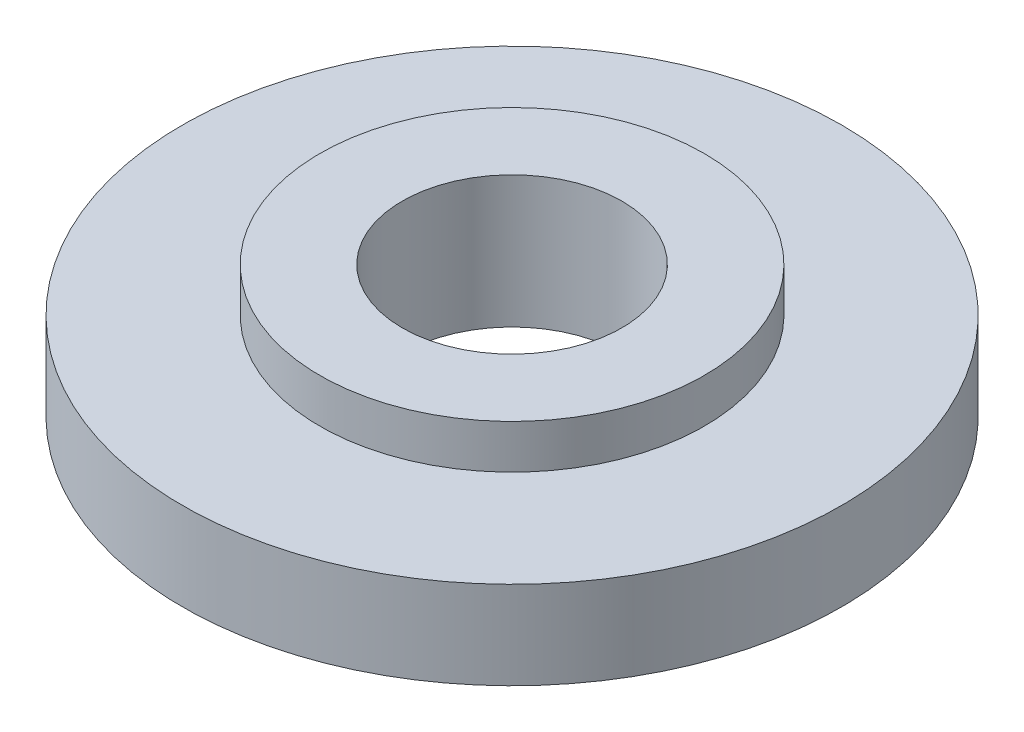
ISO-10303-21;
HEADER;
FILE_DESCRIPTION(('STEP AP214'),'2;1');
FILE_NAME('part.step','',(''),(''),'','','');
FILE_SCHEMA(('AUTOMOTIVE_DESIGN { 1 0 10303 214 1 1 1 1 }'));
ENDSEC;
DATA;
#1=APPLICATION_CONTEXT('core data for automotive mechanical design processes');
#2=APPLICATION_PROTOCOL_DEFINITION('international standard','automotive_design',2000,#1);
#3=PRODUCT_CONTEXT('',#1,'mechanical');
#4=PRODUCT('Part','Part','',(#3));
#5=PRODUCT_RELATED_PRODUCT_CATEGORY('part','',(#4));
#6=PRODUCT_DEFINITION_FORMATION('','',#4);
#7=PRODUCT_DEFINITION_CONTEXT('part definition',#1,'design');
#8=PRODUCT_DEFINITION('design','',#6,#7);
#9=PRODUCT_DEFINITION_SHAPE('','',#8);
#10=(LENGTH_UNIT() NAMED_UNIT(*) SI_UNIT(.MILLI.,.METRE.));
#11=(NAMED_UNIT(*) PLANE_ANGLE_UNIT() SI_UNIT($,.RADIAN.));
#12=(NAMED_UNIT(*) SI_UNIT($,.STERADIAN.) SOLID_ANGLE_UNIT());
#13=UNCERTAINTY_MEASURE_WITH_UNIT(LENGTH_MEASURE(1.E-05),#10,'distance_accuracy_value','');
#14=(GEOMETRIC_REPRESENTATION_CONTEXT(3) GLOBAL_UNCERTAINTY_ASSIGNED_CONTEXT((#13)) GLOBAL_UNIT_ASSIGNED_CONTEXT((#10,
#11,#12)) REPRESENTATION_CONTEXT('',''));
#15=CARTESIAN_POINT('',(0.,0.,0.));
#16=DIRECTION('',(0.,0.,1.));
#17=DIRECTION('',(1.,0.,0.));
#18=AXIS2_PLACEMENT_3D('',#15,#16,#17);
#19=CARTESIAN_POINT('',(0.,-10.,0.));
#20=DIRECTION('',(0.,-1.,0.));
#21=DIRECTION('',(0.,0.,-1.));
#22=AXIS2_PLACEMENT_3D('',#19,#20,#21);
#23=CYLINDRICAL_SURFACE('',#22,20.);
#24=CARTESIAN_POINT('',(0.,0.,0.));
#25=DIRECTION('',(0.,-1.,0.));
#26=DIRECTION('',(0.,0.,-1.));
#27=AXIS2_PLACEMENT_3D('',#24,#25,#26);
#28=CIRCLE('',#27,20.);
#29=CARTESIAN_POINT('',(0.,0.,-20.));
#30=VERTEX_POINT('',#29);
#31=EDGE_CURVE('E10',#30,#30,#28,.T.);
#32=ORIENTED_EDGE('',*,*,#31,.T.);
#33=EDGE_LOOP('',(#32));
#34=FACE_BOUND('',#33,.T.);
#35=CARTESIAN_POINT('',(0.,24.,0.));
#36=DIRECTION('',(0.,-1.,0.));
#37=DIRECTION('',(0.,0.,-1.));
#38=AXIS2_PLACEMENT_3D('',#35,#36,#37);
#39=CIRCLE('',#38,20.);
#40=CARTESIAN_POINT('',(0.,24.,-20.));
#41=VERTEX_POINT('',#40);
#42=EDGE_CURVE('E59',#41,#41,#39,.T.);
#43=ORIENTED_EDGE('',*,*,#42,.F.);
#44=EDGE_LOOP('',(#43));
#45=FACE_BOUND('',#44,.T.);
#46=ADVANCED_FACE('F37',(#34,#45),#23,.F.);
#47=CARTESIAN_POINT('',(20.,0.,0.));
#48=DIRECTION('',(0.,-1.,0.));
#49=DIRECTION('',(0.,0.,-1.));
#50=AXIS2_PLACEMENT_3D('',#47,#48,#49);
#51=PLANE('',#50);
#52=CARTESIAN_POINT('',(0.,0.,0.));
#53=DIRECTION('',(0.,-1.,0.));
#54=DIRECTION('',(0.,0.,-1.));
#55=AXIS2_PLACEMENT_3D('',#52,#53,#54);
#56=CIRCLE('',#55,60.);
#57=CARTESIAN_POINT('',(0.,0.,-60.));
#58=VERTEX_POINT('',#57);
#59=EDGE_CURVE('E43',#58,#58,#56,.T.);
#60=ORIENTED_EDGE('',*,*,#59,.T.);
#61=EDGE_LOOP('',(#60));
#62=FACE_BOUND('',#61,.T.);
#63=ORIENTED_EDGE('',*,*,#31,.F.);
#64=EDGE_LOOP('',(#63));
#65=FACE_BOUND('',#64,.T.);
#66=ADVANCED_FACE('F67',(#62,#65),#51,.T.);
#67=CARTESIAN_POINT('',(0.,-10.,0.));
#68=DIRECTION('',(0.,-1.,0.));
#69=DIRECTION('',(0.,0.,-1.));
#70=AXIS2_PLACEMENT_3D('',#67,#68,#69);
#71=CYLINDRICAL_SURFACE('',#70,60.);
#72=CARTESIAN_POINT('',(0.,16.,0.));
#73=DIRECTION('',(0.,-1.,0.));
#74=DIRECTION('',(0.,0.,-1.));
#75=AXIS2_PLACEMENT_3D('',#72,#73,#74);
#76=CIRCLE('',#75,60.);
#77=CARTESIAN_POINT('',(0.,16.,-60.));
#78=VERTEX_POINT('',#77);
#79=EDGE_CURVE('E47',#78,#78,#76,.T.);
#80=ORIENTED_EDGE('',*,*,#79,.T.);
#81=EDGE_LOOP('',(#80));
#82=FACE_BOUND('',#81,.T.);
#83=ORIENTED_EDGE('',*,*,#59,.F.);
#84=EDGE_LOOP('',(#83));
#85=FACE_BOUND('',#84,.T.);
#86=ADVANCED_FACE('F71',(#82,#85),#71,.T.);
#87=CARTESIAN_POINT('',(60.,16.,0.));
#88=DIRECTION('',(0.,1.,0.));
#89=DIRECTION('',(0.,0.,1.));
#90=AXIS2_PLACEMENT_3D('',#87,#88,#89);
#91=PLANE('',#90);
#92=CARTESIAN_POINT('',(0.,16.,0.));
#93=DIRECTION('',(0.,-1.,0.));
#94=DIRECTION('',(0.,0.,-1.));
#95=AXIS2_PLACEMENT_3D('',#92,#93,#94);
#96=CIRCLE('',#95,35.);
#97=CARTESIAN_POINT('',(0.,16.,-35.));
#98=VERTEX_POINT('',#97);
#99=EDGE_CURVE('E51',#98,#98,#96,.T.);
#100=ORIENTED_EDGE('',*,*,#99,.T.);
#101=EDGE_LOOP('',(#100));
#102=FACE_BOUND('',#101,.T.);
#103=ORIENTED_EDGE('',*,*,#79,.F.);
#104=EDGE_LOOP('',(#103));
#105=FACE_BOUND('',#104,.T.);
#106=ADVANCED_FACE('F75',(#102,#105),#91,.T.);
#107=CARTESIAN_POINT('',(0.,-10.,0.));
#108=DIRECTION('',(0.,-1.,0.));
#109=DIRECTION('',(0.,0.,-1.));
#110=AXIS2_PLACEMENT_3D('',#107,#108,#109);
#111=CYLINDRICAL_SURFACE('',#110,35.);
#112=CARTESIAN_POINT('',(0.,24.,0.));
#113=DIRECTION('',(0.,-1.,0.));
#114=DIRECTION('',(0.,0.,-1.));
#115=AXIS2_PLACEMENT_3D('',#112,#113,#114);
#116=CIRCLE('',#115,35.);
#117=CARTESIAN_POINT('',(0.,24.,-35.));
#118=VERTEX_POINT('',#117);
#119=EDGE_CURVE('E56',#118,#118,#116,.T.);
#120=ORIENTED_EDGE('',*,*,#119,.T.);
#121=EDGE_LOOP('',(#120));
#122=FACE_BOUND('',#121,.T.);
#123=ORIENTED_EDGE('',*,*,#99,.F.);
#124=EDGE_LOOP('',(#123));
#125=FACE_BOUND('',#124,.T.);
#126=ADVANCED_FACE('F82',(#122,#125),#111,.T.);
#127=CARTESIAN_POINT('',(35.,24.,0.));
#128=DIRECTION('',(0.,1.,0.));
#129=DIRECTION('',(0.,0.,1.));
#130=AXIS2_PLACEMENT_3D('',#127,#128,#129);
#131=PLANE('',#130);
#132=ORIENTED_EDGE('',*,*,#42,.T.);
#133=EDGE_LOOP('',(#132));
#134=FACE_BOUND('',#133,.T.);
#135=ORIENTED_EDGE('',*,*,#119,.F.);
#136=EDGE_LOOP('',(#135));
#137=FACE_BOUND('',#136,.T.);
#138=ADVANCED_FACE('F63',(#134,#137),#131,.T.);
#139=CLOSED_SHELL('',(#46,#66,#86,#106,#126,#138));
#140=MANIFOLD_SOLID_BREP('B2',#139);
#141=ADVANCED_BREP_SHAPE_REPRESENTATION('',(#18,#140),#14);
#142=SHAPE_DEFINITION_REPRESENTATION(#9,#141);
ENDSEC;
END-ISO-10303-21;
